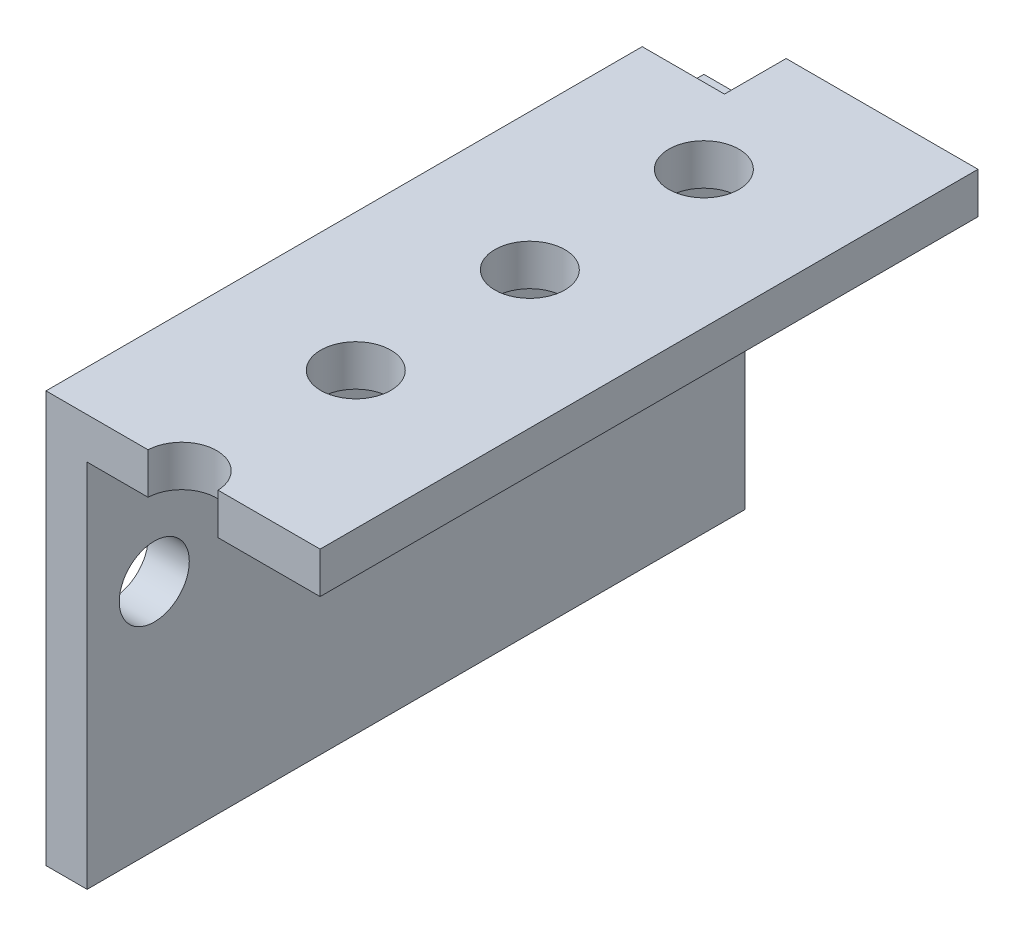
ISO-10303-21;
HEADER;
FILE_DESCRIPTION(('STEP AP214'),'2;1');
FILE_NAME('part.step','',(''),(''),'','','');
FILE_SCHEMA(('AUTOMOTIVE_DESIGN { 1 0 10303 214 1 1 1 1 }'));
ENDSEC;
DATA;
#1=APPLICATION_CONTEXT('core data for automotive mechanical design processes');
#2=APPLICATION_PROTOCOL_DEFINITION('international standard','automotive_design',2000,#1);
#3=PRODUCT_CONTEXT('',#1,'mechanical');
#4=PRODUCT('Part','Part','',(#3));
#5=PRODUCT_RELATED_PRODUCT_CATEGORY('part','',(#4));
#6=PRODUCT_DEFINITION_FORMATION('','',#4);
#7=PRODUCT_DEFINITION_CONTEXT('part definition',#1,'design');
#8=PRODUCT_DEFINITION('design','',#6,#7);
#9=PRODUCT_DEFINITION_SHAPE('','',#8);
#10=(LENGTH_UNIT() NAMED_UNIT(*) SI_UNIT(.MILLI.,.METRE.));
#11=(NAMED_UNIT(*) PLANE_ANGLE_UNIT() SI_UNIT($,.RADIAN.));
#12=(NAMED_UNIT(*) SI_UNIT($,.STERADIAN.) SOLID_ANGLE_UNIT());
#13=UNCERTAINTY_MEASURE_WITH_UNIT(LENGTH_MEASURE(1.E-05),#10,'distance_accuracy_value','');
#14=(GEOMETRIC_REPRESENTATION_CONTEXT(3) GLOBAL_UNCERTAINTY_ASSIGNED_CONTEXT((#13)) GLOBAL_UNIT_ASSIGNED_CONTEXT((#10,
#11,#12)) REPRESENTATION_CONTEXT('',''));
#15=CARTESIAN_POINT('',(0.,0.,0.));
#16=DIRECTION('',(0.,0.,1.));
#17=DIRECTION('',(1.,0.,0.));
#18=AXIS2_PLACEMENT_3D('',#15,#16,#17);
#19=CARTESIAN_POINT('',(0.,100.,0.));
#20=DIRECTION('',(0.,0.,1.));
#21=DIRECTION('',(1.,0.,0.));
#22=AXIS2_PLACEMENT_3D('',#19,#20,#21);
#23=PLANE('',#22);
#24=DIRECTION('',(1.,0.,0.));
#25=VECTOR('',#24,1.);
#26=CARTESIAN_POINT('',(0.,115.,0.));
#27=LINE('',#26,#25);
#28=CARTESIAN_POINT('',(4.5,115.,0.));
#29=VERTEX_POINT('',#28);
#30=CARTESIAN_POINT('',(18.5,115.,0.));
#31=VERTEX_POINT('',#30);
#32=EDGE_CURVE('E257',#29,#31,#27,.T.);
#33=ORIENTED_EDGE('',*,*,#32,.T.);
#34=DIRECTION('',(0.,-1.,0.));
#35=VECTOR('',#34,1.);
#36=CARTESIAN_POINT('',(18.5,100.,0.));
#37=LINE('',#36,#35);
#38=CARTESIAN_POINT('',(18.5,112.,0.));
#39=VERTEX_POINT('',#38);
#40=EDGE_CURVE('E261',#31,#39,#37,.T.);
#41=ORIENTED_EDGE('',*,*,#40,.T.);
#42=DIRECTION('',(1.,0.,0.));
#43=VECTOR('',#42,1.);
#44=CARTESIAN_POINT('',(0.,112.,0.));
#45=LINE('',#44,#43);
#46=CARTESIAN_POINT('',(4.5,112.,0.));
#47=VERTEX_POINT('',#46);
#48=EDGE_CURVE('E265',#47,#39,#45,.T.);
#49=ORIENTED_EDGE('',*,*,#48,.F.);
#50=DIRECTION('',(0.,-1.,0.));
#51=VECTOR('',#50,1.);
#52=CARTESIAN_POINT('',(4.5,100.,0.));
#53=LINE('',#52,#51);
#54=EDGE_CURVE('E56',#29,#47,#53,.T.);
#55=ORIENTED_EDGE('',*,*,#54,.F.);
#56=EDGE_LOOP('',(#33,#41,#49,#55));
#57=FACE_BOUND('',#56,.T.);
#58=ADVANCED_FACE('F47',(#57),#23,.F.);
#59=CARTESIAN_POINT('',(0.,100.,48.));
#60=DIRECTION('',(0.,0.,1.));
#61=DIRECTION('',(1.,0.,0.));
#62=AXIS2_PLACEMENT_3D('',#59,#60,#61);
#63=PLANE('',#62);
#64=DIRECTION('',(0.,-1.,0.));
#65=VECTOR('',#64,1.);
#66=CARTESIAN_POINT('',(11.0530423028227,115.,48.));
#67=LINE('',#66,#65);
#68=CARTESIAN_POINT('',(11.0530423028227,115.,48.));
#69=VERTEX_POINT('',#68);
#70=CARTESIAN_POINT('',(11.0530423028227,112.,48.));
#71=VERTEX_POINT('',#70);
#72=EDGE_CURVE('E295',#69,#71,#67,.T.);
#73=ORIENTED_EDGE('',*,*,#72,.T.);
#74=DIRECTION('',(1.,0.,0.));
#75=VECTOR('',#74,1.);
#76=CARTESIAN_POINT('',(0.,112.,48.));
#77=LINE('',#76,#75);
#78=CARTESIAN_POINT('',(18.5,112.,48.));
#79=VERTEX_POINT('',#78);
#80=EDGE_CURVE('E244',#71,#79,#77,.T.);
#81=ORIENTED_EDGE('',*,*,#80,.T.);
#82=DIRECTION('',(0.,-1.,0.));
#83=VECTOR('',#82,1.);
#84=CARTESIAN_POINT('',(18.5,100.,48.));
#85=LINE('',#84,#83);
#86=CARTESIAN_POINT('',(18.5,115.,48.));
#87=VERTEX_POINT('',#86);
#88=EDGE_CURVE('E240',#87,#79,#85,.T.);
#89=ORIENTED_EDGE('',*,*,#88,.F.);
#90=DIRECTION('',(1.,0.,0.));
#91=VECTOR('',#90,1.);
#92=CARTESIAN_POINT('',(0.,115.,48.));
#93=LINE('',#92,#91);
#94=EDGE_CURVE('E234',#69,#87,#93,.T.);
#95=ORIENTED_EDGE('',*,*,#94,.F.);
#96=EDGE_LOOP('',(#73,#81,#89,#95));
#97=FACE_BOUND('',#96,.T.);
#98=ADVANCED_FACE('F339',(#97),#63,.T.);
#99=CARTESIAN_POINT('',(-1.5,100.,48.));
#100=DIRECTION('',(1.,0.,0.));
#101=DIRECTION('',(0.,-1.,0.));
#102=AXIS2_PLACEMENT_3D('',#99,#100,#101);
#103=PLANE('',#102);
#104=CARTESIAN_POINT('',(-1.5,102.,5.));
#105=DIRECTION('',(1.,0.,0.));
#106=DIRECTION('',(0.,1.,0.));
#107=AXIS2_PLACEMENT_3D('',#104,#105,#106);
#108=CIRCLE('',#107,2.555);
#109=CARTESIAN_POINT('',(-1.5,104.555,5.));
#110=VERTEX_POINT('',#109);
#111=EDGE_CURVE('E182',#110,#110,#108,.T.);
#112=ORIENTED_EDGE('',*,*,#111,.T.);
#113=EDGE_LOOP('',(#112));
#114=FACE_BOUND('',#113,.T.);
#115=CARTESIAN_POINT('',(-1.5,102.,17.7));
#116=DIRECTION('',(1.,0.,0.));
#117=DIRECTION('',(0.,1.,0.));
#118=AXIS2_PLACEMENT_3D('',#115,#116,#117);
#119=CIRCLE('',#118,2.555);
#120=CARTESIAN_POINT('',(-1.5,104.555,17.7));
#121=VERTEX_POINT('',#120);
#122=EDGE_CURVE('E187',#121,#121,#119,.T.);
#123=ORIENTED_EDGE('',*,*,#122,.T.);
#124=EDGE_LOOP('',(#123));
#125=FACE_BOUND('',#124,.T.);
#126=CARTESIAN_POINT('',(-1.5,102.,30.4));
#127=DIRECTION('',(1.,0.,0.));
#128=DIRECTION('',(0.,1.,0.));
#129=AXIS2_PLACEMENT_3D('',#126,#127,#128);
#130=CIRCLE('',#129,2.55500000000001);
#131=CARTESIAN_POINT('',(-1.5,104.555,30.4));
#132=VERTEX_POINT('',#131);
#133=EDGE_CURVE('E191',#132,#132,#130,.T.);
#134=ORIENTED_EDGE('',*,*,#133,.T.);
#135=EDGE_LOOP('',(#134));
#136=FACE_BOUND('',#135,.T.);
#137=CARTESIAN_POINT('',(-1.5,102.,43.1));
#138=DIRECTION('',(1.,0.,0.));
#139=DIRECTION('',(0.,1.,0.));
#140=AXIS2_PLACEMENT_3D('',#137,#138,#139);
#141=CIRCLE('',#140,2.555);
#142=CARTESIAN_POINT('',(-1.5,104.555,43.1));
#143=VERTEX_POINT('',#142);
#144=EDGE_CURVE('E181',#143,#143,#141,.T.);
#145=ORIENTED_EDGE('',*,*,#144,.T.);
#146=EDGE_LOOP('',(#145));
#147=FACE_BOUND('',#146,.T.);
#148=DIRECTION('',(0.,1.,0.));
#149=VECTOR('',#148,1.);
#150=CARTESIAN_POINT('',(-1.5,100.,0.));
#151=LINE('',#150,#149);
#152=CARTESIAN_POINT('',(-1.5,85.,0.));
#153=VERTEX_POINT('',#152);
#154=CARTESIAN_POINT('',(-1.5,111.,0.));
#155=VERTEX_POINT('',#154);
#156=EDGE_CURVE('E202',#153,#155,#151,.T.);
#157=ORIENTED_EDGE('',*,*,#156,.F.);
#158=DIRECTION('',(0.,0.,-1.));
#159=VECTOR('',#158,1.);
#160=CARTESIAN_POINT('',(-1.5,85.,48.));
#161=LINE('',#160,#159);
#162=CARTESIAN_POINT('',(-1.5,85.,48.));
#163=VERTEX_POINT('',#162);
#164=EDGE_CURVE('E254',#163,#153,#161,.T.);
#165=ORIENTED_EDGE('',*,*,#164,.F.);
#166=DIRECTION('',(0.,1.,0.));
#167=VECTOR('',#166,1.);
#168=CARTESIAN_POINT('',(-1.5,100.,48.));
#169=LINE('',#168,#167);
#170=CARTESIAN_POINT('',(-1.5,115.,48.));
#171=VERTEX_POINT('',#170);
#172=EDGE_CURVE('E231',#163,#171,#169,.T.);
#173=ORIENTED_EDGE('',*,*,#172,.T.);
#174=DIRECTION('',(0.,0.,-1.));
#175=VECTOR('',#174,1.);
#176=CARTESIAN_POINT('',(-1.5,115.,48.));
#177=LINE('',#176,#175);
#178=CARTESIAN_POINT('',(-1.5,115.,4.5));
#179=VERTEX_POINT('',#178);
#180=EDGE_CURVE('E159',#171,#179,#177,.T.);
#181=ORIENTED_EDGE('',*,*,#180,.T.);
#182=DIRECTION('',(0.,-1.,0.));
#183=VECTOR('',#182,1.);
#184=CARTESIAN_POINT('',(-1.5,115.,4.5));
#185=LINE('',#184,#183);
#186=CARTESIAN_POINT('',(-1.5,111.,4.5));
#187=VERTEX_POINT('',#186);
#188=EDGE_CURVE('E141',#179,#187,#185,.T.);
#189=ORIENTED_EDGE('',*,*,#188,.T.);
#190=DIRECTION('',(0.,0.,-1.));
#191=VECTOR('',#190,1.);
#192=CARTESIAN_POINT('',(-1.5,111.,4.5));
#193=LINE('',#192,#191);
#194=EDGE_CURVE('E148',#187,#155,#193,.T.);
#195=ORIENTED_EDGE('',*,*,#194,.T.);
#196=EDGE_LOOP('',(#157,#165,#173,#181,#189,#195));
#197=FACE_BOUND('',#196,.T.);
#198=ADVANCED_FACE('F49',(#114,#125,#136,#147,#197),#103,.F.);
#199=CARTESIAN_POINT('',(0.,115.,48.));
#200=DIRECTION('',(0.,-1.,0.));
#201=DIRECTION('',(0.,0.,1.));
#202=AXIS2_PLACEMENT_3D('',#199,#200,#201);
#203=PLANE('',#202);
#204=CARTESIAN_POINT('',(8.5,115.,10.));
#205=DIRECTION('',(0.,1.,0.));
#206=DIRECTION('',(0.,0.,1.));
#207=AXIS2_PLACEMENT_3D('',#204,#205,#206);
#208=CIRCLE('',#207,2.555);
#209=CARTESIAN_POINT('',(8.5,115.,12.555));
#210=VERTEX_POINT('',#209);
#211=EDGE_CURVE('E198',#210,#210,#208,.T.);
#212=ORIENTED_EDGE('',*,*,#211,.F.);
#213=EDGE_LOOP('',(#212));
#214=FACE_BOUND('',#213,.T.);
#215=CARTESIAN_POINT('',(8.50000000000027,115.,35.4));
#216=DIRECTION('',(0.,1.,0.));
#217=DIRECTION('',(0.,0.,1.));
#218=AXIS2_PLACEMENT_3D('',#215,#216,#217);
#219=CIRCLE('',#218,2.555);
#220=CARTESIAN_POINT('',(8.50000000000027,115.,37.955));
#221=VERTEX_POINT('',#220);
#222=EDGE_CURVE('E213',#221,#221,#219,.T.);
#223=ORIENTED_EDGE('',*,*,#222,.F.);
#224=EDGE_LOOP('',(#223));
#225=FACE_BOUND('',#224,.T.);
#226=CARTESIAN_POINT('',(8.50000000000014,115.,22.7));
#227=DIRECTION('',(0.,1.,0.));
#228=DIRECTION('',(0.,0.,1.));
#229=AXIS2_PLACEMENT_3D('',#226,#227,#228);
#230=CIRCLE('',#229,2.555);
#231=CARTESIAN_POINT('',(8.50000000000014,115.,25.255));
#232=VERTEX_POINT('',#231);
#233=EDGE_CURVE('E212',#232,#232,#230,.T.);
#234=ORIENTED_EDGE('',*,*,#233,.F.);
#235=EDGE_LOOP('',(#234));
#236=FACE_BOUND('',#235,.T.);
#237=DIRECTION('',(-1.,0.,0.));
#238=VECTOR('',#237,1.);
#239=CARTESIAN_POINT('',(-1.5,115.,4.5));
#240=LINE('',#239,#238);
#241=CARTESIAN_POINT('',(4.5,115.,4.5));
#242=VERTEX_POINT('',#241);
#243=EDGE_CURVE('E155',#242,#179,#240,.T.);
#244=ORIENTED_EDGE('',*,*,#243,.T.);
#245=ORIENTED_EDGE('',*,*,#180,.F.);
#246=CARTESIAN_POINT('',(5.94695769717814,115.,48.));
#247=VERTEX_POINT('',#246);
#248=EDGE_CURVE('E236',#171,#247,#93,.T.);
#249=ORIENTED_EDGE('',*,*,#248,.T.);
#250=CARTESIAN_POINT('',(8.5000000000004,115.,48.1));
#251=DIRECTION('',(0.,1.,0.));
#252=DIRECTION('',(0.,0.,1.));
#253=AXIS2_PLACEMENT_3D('',#250,#251,#252);
#254=CIRCLE('',#253,2.555);
#255=EDGE_CURVE('E221',#69,#247,#254,.T.);
#256=ORIENTED_EDGE('',*,*,#255,.F.);
#257=ORIENTED_EDGE('',*,*,#94,.T.);
#258=DIRECTION('',(0.,0.,-1.));
#259=VECTOR('',#258,1.);
#260=CARTESIAN_POINT('',(18.5,115.,48.));
#261=LINE('',#260,#259);
#262=EDGE_CURVE('E288',#87,#31,#261,.T.);
#263=ORIENTED_EDGE('',*,*,#262,.T.);
#264=ORIENTED_EDGE('',*,*,#32,.F.);
#265=DIRECTION('',(0.,0.,-1.));
#266=VECTOR('',#265,1.);
#267=CARTESIAN_POINT('',(4.5,115.,4.5));
#268=LINE('',#267,#266);
#269=EDGE_CURVE('E154',#242,#29,#268,.T.);
#270=ORIENTED_EDGE('',*,*,#269,.F.);
#271=EDGE_LOOP('',(#244,#245,#249,#256,#257,#263,#264,#270));
#272=FACE_BOUND('',#271,.T.);
#273=ADVANCED_FACE('F331',(#214,#225,#236,#272),#203,.F.);
#274=CARTESIAN_POINT('',(18.5,100.,48.));
#275=DIRECTION('',(-1.,0.,0.));
#276=DIRECTION('',(0.,0.,1.));
#277=AXIS2_PLACEMENT_3D('',#274,#275,#276);
#278=PLANE('',#277);
#279=ORIENTED_EDGE('',*,*,#40,.F.);
#280=ORIENTED_EDGE('',*,*,#262,.F.);
#281=ORIENTED_EDGE('',*,*,#88,.T.);
#282=DIRECTION('',(0.,0.,-1.));
#283=VECTOR('',#282,1.);
#284=CARTESIAN_POINT('',(18.5,112.,48.));
#285=LINE('',#284,#283);
#286=EDGE_CURVE('E285',#79,#39,#285,.T.);
#287=ORIENTED_EDGE('',*,*,#286,.T.);
#288=EDGE_LOOP('',(#279,#280,#281,#287));
#289=FACE_BOUND('',#288,.T.);
#290=ADVANCED_FACE('F336',(#289),#278,.F.);
#291=CARTESIAN_POINT('',(0.,112.,48.));
#292=DIRECTION('',(0.,-1.,0.));
#293=DIRECTION('',(0.,0.,1.));
#294=AXIS2_PLACEMENT_3D('',#291,#292,#293);
#295=PLANE('',#294);
#296=DIRECTION('',(0.,0.,-1.));
#297=VECTOR('',#296,1.);
#298=CARTESIAN_POINT('',(4.5,112.,48.));
#299=LINE('',#298,#297);
#300=CARTESIAN_POINT('',(4.5,112.,4.5));
#301=VERTEX_POINT('',#300);
#302=EDGE_CURVE('E175',#301,#47,#299,.T.);
#303=ORIENTED_EDGE('',*,*,#302,.T.);
#304=ORIENTED_EDGE('',*,*,#48,.T.);
#305=ORIENTED_EDGE('',*,*,#286,.F.);
#306=ORIENTED_EDGE('',*,*,#80,.F.);
#307=CARTESIAN_POINT('',(8.5000000000004,112.,48.1));
#308=DIRECTION('',(0.,1.,0.));
#309=DIRECTION('',(0.,0.,1.));
#310=AXIS2_PLACEMENT_3D('',#307,#308,#309);
#311=CIRCLE('',#310,2.555);
#312=CARTESIAN_POINT('',(5.94695769717814,112.,48.));
#313=VERTEX_POINT('',#312);
#314=EDGE_CURVE('E207',#71,#313,#311,.T.);
#315=ORIENTED_EDGE('',*,*,#314,.T.);
#316=CARTESIAN_POINT('',(1.5,112.,48.));
#317=VERTEX_POINT('',#316);
#318=EDGE_CURVE('E245',#317,#313,#77,.T.);
#319=ORIENTED_EDGE('',*,*,#318,.F.);
#320=DIRECTION('',(0.,0.,-1.));
#321=VECTOR('',#320,1.);
#322=CARTESIAN_POINT('',(1.5,112.,48.));
#323=LINE('',#322,#321);
#324=CARTESIAN_POINT('',(1.5,112.,4.5));
#325=VERTEX_POINT('',#324);
#326=EDGE_CURVE('E281',#317,#325,#323,.T.);
#327=ORIENTED_EDGE('',*,*,#326,.T.);
#328=DIRECTION('',(-1.,0.,0.));
#329=VECTOR('',#328,1.);
#330=CARTESIAN_POINT('',(0.,112.,4.5));
#331=LINE('',#330,#329);
#332=EDGE_CURVE('E178',#301,#325,#331,.T.);
#333=ORIENTED_EDGE('',*,*,#332,.F.);
#334=EDGE_LOOP('',(#303,#304,#305,#306,#315,#319,#327,#333));
#335=FACE_BOUND('',#334,.T.);
#336=CARTESIAN_POINT('',(8.5,112.,10.));
#337=DIRECTION('',(0.,1.,0.));
#338=DIRECTION('',(0.,0.,1.));
#339=AXIS2_PLACEMENT_3D('',#336,#337,#338);
#340=CIRCLE('',#339,2.555);
#341=CARTESIAN_POINT('',(8.5,112.,12.555));
#342=VERTEX_POINT('',#341);
#343=EDGE_CURVE('E203',#342,#342,#340,.T.);
#344=ORIENTED_EDGE('',*,*,#343,.T.);
#345=EDGE_LOOP('',(#344));
#346=FACE_BOUND('',#345,.T.);
#347=CARTESIAN_POINT('',(8.50000000000027,112.,35.4));
#348=DIRECTION('',(0.,1.,0.));
#349=DIRECTION('',(0.,0.,1.));
#350=AXIS2_PLACEMENT_3D('',#347,#348,#349);
#351=CIRCLE('',#350,2.555);
#352=CARTESIAN_POINT('',(8.50000000000027,112.,37.955));
#353=VERTEX_POINT('',#352);
#354=EDGE_CURVE('E208',#353,#353,#351,.T.);
#355=ORIENTED_EDGE('',*,*,#354,.T.);
#356=EDGE_LOOP('',(#355));
#357=FACE_BOUND('',#356,.T.);
#358=CARTESIAN_POINT('',(8.50000000000014,112.,22.7));
#359=DIRECTION('',(0.,1.,0.));
#360=DIRECTION('',(0.,0.,1.));
#361=AXIS2_PLACEMENT_3D('',#358,#359,#360);
#362=CIRCLE('',#361,2.555);
#363=CARTESIAN_POINT('',(8.50000000000014,112.,25.255));
#364=VERTEX_POINT('',#363);
#365=EDGE_CURVE('E224',#364,#364,#362,.T.);
#366=ORIENTED_EDGE('',*,*,#365,.T.);
#367=EDGE_LOOP('',(#366));
#368=FACE_BOUND('',#367,.T.);
#369=ADVANCED_FACE('F324',(#335,#346,#357,#368),#295,.T.);
#370=CARTESIAN_POINT('',(1.5,100.,48.));
#371=DIRECTION('',(1.,0.,0.));
#372=DIRECTION('',(0.,-1.,0.));
#373=AXIS2_PLACEMENT_3D('',#370,#371,#372);
#374=PLANE('',#373);
#375=DIRECTION('',(0.,0.,1.));
#376=VECTOR('',#375,1.);
#377=CARTESIAN_POINT('',(1.5,111.,48.));
#378=LINE('',#377,#376);
#379=CARTESIAN_POINT('',(1.5,111.,0.));
#380=VERTEX_POINT('',#379);
#381=CARTESIAN_POINT('',(1.5,111.,4.5));
#382=VERTEX_POINT('',#381);
#383=EDGE_CURVE('E171',#380,#382,#378,.T.);
#384=ORIENTED_EDGE('',*,*,#383,.T.);
#385=DIRECTION('',(0.,-1.,0.));
#386=VECTOR('',#385,1.);
#387=CARTESIAN_POINT('',(1.5,100.,4.5));
#388=LINE('',#387,#386);
#389=EDGE_CURVE('E11',#325,#382,#388,.T.);
#390=ORIENTED_EDGE('',*,*,#389,.F.);
#391=ORIENTED_EDGE('',*,*,#326,.F.);
#392=DIRECTION('',(0.,1.,0.));
#393=VECTOR('',#392,1.);
#394=CARTESIAN_POINT('',(1.5,100.,48.));
#395=LINE('',#394,#393);
#396=CARTESIAN_POINT('',(1.5,85.,48.));
#397=VERTEX_POINT('',#396);
#398=EDGE_CURVE('E248',#397,#317,#395,.T.);
#399=ORIENTED_EDGE('',*,*,#398,.F.);
#400=DIRECTION('',(0.,0.,-1.));
#401=VECTOR('',#400,1.);
#402=CARTESIAN_POINT('',(1.5,85.,48.));
#403=LINE('',#402,#401);
#404=CARTESIAN_POINT('',(1.5,85.,0.));
#405=VERTEX_POINT('',#404);
#406=EDGE_CURVE('E278',#397,#405,#403,.T.);
#407=ORIENTED_EDGE('',*,*,#406,.T.);
#408=DIRECTION('',(0.,1.,0.));
#409=VECTOR('',#408,1.);
#410=CARTESIAN_POINT('',(1.5,100.,0.));
#411=LINE('',#410,#409);
#412=EDGE_CURVE('E269',#405,#380,#411,.T.);
#413=ORIENTED_EDGE('',*,*,#412,.T.);
#414=EDGE_LOOP('',(#384,#390,#391,#399,#407,#413));
#415=FACE_BOUND('',#414,.T.);
#416=CARTESIAN_POINT('',(1.5,102.,5.));
#417=DIRECTION('',(-1.,0.,0.));
#418=DIRECTION('',(0.,-1.,0.));
#419=AXIS2_PLACEMENT_3D('',#416,#417,#418);
#420=CIRCLE('',#419,2.555);
#421=CARTESIAN_POINT('',(1.5,99.445,5.));
#422=VERTEX_POINT('',#421);
#423=EDGE_CURVE('E217',#422,#422,#420,.T.);
#424=ORIENTED_EDGE('',*,*,#423,.T.);
#425=EDGE_LOOP('',(#424));
#426=FACE_BOUND('',#425,.T.);
#427=CARTESIAN_POINT('',(1.5,102.,17.7));
#428=DIRECTION('',(-1.,0.,0.));
#429=DIRECTION('',(0.,-1.,0.));
#430=AXIS2_PLACEMENT_3D('',#427,#428,#429);
#431=CIRCLE('',#430,2.555);
#432=CARTESIAN_POINT('',(1.5,99.445,17.7));
#433=VERTEX_POINT('',#432);
#434=EDGE_CURVE('E306',#433,#433,#431,.T.);
#435=ORIENTED_EDGE('',*,*,#434,.T.);
#436=EDGE_LOOP('',(#435));
#437=FACE_BOUND('',#436,.T.);
#438=CARTESIAN_POINT('',(1.5,102.,30.4));
#439=DIRECTION('',(-1.,0.,0.));
#440=DIRECTION('',(0.,-1.,0.));
#441=AXIS2_PLACEMENT_3D('',#438,#439,#440);
#442=CIRCLE('',#441,2.55500000000001);
#443=CARTESIAN_POINT('',(1.5,99.445,30.4));
#444=VERTEX_POINT('',#443);
#445=EDGE_CURVE('E302',#444,#444,#442,.T.);
#446=ORIENTED_EDGE('',*,*,#445,.T.);
#447=EDGE_LOOP('',(#446));
#448=FACE_BOUND('',#447,.T.);
#449=CARTESIAN_POINT('',(1.5,102.,43.1));
#450=DIRECTION('',(-1.,0.,0.));
#451=DIRECTION('',(0.,-1.,0.));
#452=AXIS2_PLACEMENT_3D('',#449,#450,#451);
#453=CIRCLE('',#452,2.555);
#454=CARTESIAN_POINT('',(1.5,99.445,43.1));
#455=VERTEX_POINT('',#454);
#456=EDGE_CURVE('E186',#455,#455,#453,.T.);
#457=ORIENTED_EDGE('',*,*,#456,.T.);
#458=EDGE_LOOP('',(#457));
#459=FACE_BOUND('',#458,.T.);
#460=ADVANCED_FACE('F351',(#415,#426,#437,#448,#459),#374,.T.);
#461=CARTESIAN_POINT('',(0.,85.,48.));
#462=DIRECTION('',(0.,-1.,0.));
#463=DIRECTION('',(0.,0.,1.));
#464=AXIS2_PLACEMENT_3D('',#461,#462,#463);
#465=PLANE('',#464);
#466=DIRECTION('',(1.,0.,0.));
#467=VECTOR('',#466,1.);
#468=CARTESIAN_POINT('',(0.,85.,0.));
#469=LINE('',#468,#467);
#470=EDGE_CURVE('E235',#153,#405,#469,.T.);
#471=ORIENTED_EDGE('',*,*,#470,.T.);
#472=ORIENTED_EDGE('',*,*,#406,.F.);
#473=DIRECTION('',(1.,0.,0.));
#474=VECTOR('',#473,1.);
#475=CARTESIAN_POINT('',(0.,85.,48.));
#476=LINE('',#475,#474);
#477=EDGE_CURVE('E251',#163,#397,#476,.T.);
#478=ORIENTED_EDGE('',*,*,#477,.F.);
#479=ORIENTED_EDGE('',*,*,#164,.T.);
#480=EDGE_LOOP('',(#471,#472,#478,#479));
#481=FACE_BOUND('',#480,.T.);
#482=ADVANCED_FACE('F357',(#481),#465,.T.);
#483=DIRECTION('',(0.,-1.,0.));
#484=VECTOR('',#483,1.);
#485=CARTESIAN_POINT('',(5.94695769717814,115.,48.));
#486=LINE('',#485,#484);
#487=EDGE_CURVE('E71',#313,#247,#486,.F.);
#488=ORIENTED_EDGE('',*,*,#487,.T.);
#489=ORIENTED_EDGE('',*,*,#248,.F.);
#490=ORIENTED_EDGE('',*,*,#172,.F.);
#491=ORIENTED_EDGE('',*,*,#477,.T.);
#492=ORIENTED_EDGE('',*,*,#398,.T.);
#493=ORIENTED_EDGE('',*,*,#318,.T.);
#494=EDGE_LOOP('',(#488,#489,#490,#491,#492,#493));
#495=FACE_BOUND('',#494,.T.);
#496=ADVANCED_FACE('F346',(#495),#63,.T.);
#497=ORIENTED_EDGE('',*,*,#412,.F.);
#498=ORIENTED_EDGE('',*,*,#470,.F.);
#499=ORIENTED_EDGE('',*,*,#156,.T.);
#500=DIRECTION('',(1.,0.,0.));
#501=VECTOR('',#500,1.);
#502=CARTESIAN_POINT('',(-1.5,111.,0.));
#503=LINE('',#502,#501);
#504=EDGE_CURVE('E63',#155,#380,#503,.T.);
#505=ORIENTED_EDGE('',*,*,#504,.T.);
#506=EDGE_LOOP('',(#497,#498,#499,#505));
#507=FACE_BOUND('',#506,.T.);
#508=ADVANCED_FACE('F355',(#507),#23,.F.);
#509=CARTESIAN_POINT('',(8.5000000000004,115.,48.1));
#510=DIRECTION('',(0.,-1.,0.));
#511=DIRECTION('',(0.,0.,1.));
#512=AXIS2_PLACEMENT_3D('',#509,#510,#511);
#513=CYLINDRICAL_SURFACE('',#512,2.555);
#514=ORIENTED_EDGE('',*,*,#72,.F.);
#515=ORIENTED_EDGE('',*,*,#255,.T.);
#516=ORIENTED_EDGE('',*,*,#487,.F.);
#517=ORIENTED_EDGE('',*,*,#314,.F.);
#518=EDGE_LOOP('',(#514,#515,#516,#517));
#519=FACE_BOUND('',#518,.T.);
#520=ADVANCED_FACE('F343',(#519),#513,.F.);
#521=CARTESIAN_POINT('',(8.50000000000014,115.,22.7));
#522=DIRECTION('',(0.,-1.,0.));
#523=DIRECTION('',(0.,0.,1.));
#524=AXIS2_PLACEMENT_3D('',#521,#522,#523);
#525=CYLINDRICAL_SURFACE('',#524,2.555);
#526=ORIENTED_EDGE('',*,*,#233,.T.);
#527=EDGE_LOOP('',(#526));
#528=FACE_BOUND('',#527,.T.);
#529=ORIENTED_EDGE('',*,*,#365,.F.);
#530=EDGE_LOOP('',(#529));
#531=FACE_BOUND('',#530,.T.);
#532=ADVANCED_FACE('F372',(#528,#531),#525,.F.);
#533=CARTESIAN_POINT('',(8.50000000000027,115.,35.4));
#534=DIRECTION('',(0.,-1.,0.));
#535=DIRECTION('',(0.,0.,1.));
#536=AXIS2_PLACEMENT_3D('',#533,#534,#535);
#537=CYLINDRICAL_SURFACE('',#536,2.555);
#538=ORIENTED_EDGE('',*,*,#222,.T.);
#539=EDGE_LOOP('',(#538));
#540=FACE_BOUND('',#539,.T.);
#541=ORIENTED_EDGE('',*,*,#354,.F.);
#542=EDGE_LOOP('',(#541));
#543=FACE_BOUND('',#542,.T.);
#544=ADVANCED_FACE('F376',(#540,#543),#537,.F.);
#545=CARTESIAN_POINT('',(8.5,115.,10.));
#546=DIRECTION('',(0.,-1.,0.));
#547=DIRECTION('',(0.,0.,1.));
#548=AXIS2_PLACEMENT_3D('',#545,#546,#547);
#549=CYLINDRICAL_SURFACE('',#548,2.555);
#550=ORIENTED_EDGE('',*,*,#211,.T.);
#551=EDGE_LOOP('',(#550));
#552=FACE_BOUND('',#551,.T.);
#553=ORIENTED_EDGE('',*,*,#343,.F.);
#554=EDGE_LOOP('',(#553));
#555=FACE_BOUND('',#554,.T.);
#556=ADVANCED_FACE('F382',(#552,#555),#549,.F.);
#557=CARTESIAN_POINT('',(18.5,102.,43.1));
#558=DIRECTION('',(-1.,0.,0.));
#559=DIRECTION('',(0.,1.,0.));
#560=AXIS2_PLACEMENT_3D('',#557,#558,#559);
#561=CYLINDRICAL_SURFACE('',#560,2.555);
#562=ORIENTED_EDGE('',*,*,#456,.F.);
#563=EDGE_LOOP('',(#562));
#564=FACE_BOUND('',#563,.T.);
#565=ORIENTED_EDGE('',*,*,#144,.F.);
#566=EDGE_LOOP('',(#565));
#567=FACE_BOUND('',#566,.T.);
#568=ADVANCED_FACE('F386',(#564,#567),#561,.F.);
#569=CARTESIAN_POINT('',(18.5,102.,30.4));
#570=DIRECTION('',(-1.,0.,0.));
#571=DIRECTION('',(0.,1.,0.));
#572=AXIS2_PLACEMENT_3D('',#569,#570,#571);
#573=CYLINDRICAL_SURFACE('',#572,2.55500000000001);
#574=ORIENTED_EDGE('',*,*,#445,.F.);
#575=EDGE_LOOP('',(#574));
#576=FACE_BOUND('',#575,.T.);
#577=ORIENTED_EDGE('',*,*,#133,.F.);
#578=EDGE_LOOP('',(#577));
#579=FACE_BOUND('',#578,.T.);
#580=ADVANCED_FACE('F390',(#576,#579),#573,.F.);
#581=CARTESIAN_POINT('',(18.5,102.,17.7));
#582=DIRECTION('',(-1.,0.,0.));
#583=DIRECTION('',(0.,1.,0.));
#584=AXIS2_PLACEMENT_3D('',#581,#582,#583);
#585=CYLINDRICAL_SURFACE('',#584,2.555);
#586=ORIENTED_EDGE('',*,*,#434,.F.);
#587=EDGE_LOOP('',(#586));
#588=FACE_BOUND('',#587,.T.);
#589=ORIENTED_EDGE('',*,*,#122,.F.);
#590=EDGE_LOOP('',(#589));
#591=FACE_BOUND('',#590,.T.);
#592=ADVANCED_FACE('F394',(#588,#591),#585,.F.);
#593=CARTESIAN_POINT('',(18.5,102.,5.));
#594=DIRECTION('',(-1.,0.,0.));
#595=DIRECTION('',(0.,1.,0.));
#596=AXIS2_PLACEMENT_3D('',#593,#594,#595);
#597=CYLINDRICAL_SURFACE('',#596,2.555);
#598=ORIENTED_EDGE('',*,*,#423,.F.);
#599=EDGE_LOOP('',(#598));
#600=FACE_BOUND('',#599,.T.);
#601=ORIENTED_EDGE('',*,*,#111,.F.);
#602=EDGE_LOOP('',(#601));
#603=FACE_BOUND('',#602,.T.);
#604=ADVANCED_FACE('F398',(#600,#603),#597,.F.);
#605=CARTESIAN_POINT('',(4.5,115.,4.5));
#606=DIRECTION('',(1.,0.,0.));
#607=DIRECTION('',(0.,0.,-1.));
#608=AXIS2_PLACEMENT_3D('',#605,#606,#607);
#609=PLANE('',#608);
#610=ORIENTED_EDGE('',*,*,#302,.F.);
#611=DIRECTION('',(0.,1.,0.));
#612=VECTOR('',#611,1.);
#613=CARTESIAN_POINT('',(4.5,115.,4.5));
#614=LINE('',#613,#612);
#615=EDGE_CURVE('E146',#301,#242,#614,.T.);
#616=ORIENTED_EDGE('',*,*,#615,.T.);
#617=ORIENTED_EDGE('',*,*,#269,.T.);
#618=ORIENTED_EDGE('',*,*,#54,.T.);
#619=EDGE_LOOP('',(#610,#616,#617,#618));
#620=FACE_BOUND('',#619,.T.);
#621=ADVANCED_FACE('F318',(#620),#609,.F.);
#622=CARTESIAN_POINT('',(-1.5,111.,4.5));
#623=DIRECTION('',(0.,-1.,0.));
#624=DIRECTION('',(0.,0.,1.));
#625=AXIS2_PLACEMENT_3D('',#622,#623,#624);
#626=PLANE('',#625);
#627=ORIENTED_EDGE('',*,*,#383,.F.);
#628=ORIENTED_EDGE('',*,*,#504,.F.);
#629=ORIENTED_EDGE('',*,*,#194,.F.);
#630=DIRECTION('',(1.,0.,0.));
#631=VECTOR('',#630,1.);
#632=CARTESIAN_POINT('',(-1.5,111.,4.5));
#633=LINE('',#632,#631);
#634=EDGE_CURVE('E137',#187,#382,#633,.T.);
#635=ORIENTED_EDGE('',*,*,#634,.T.);
#636=EDGE_LOOP('',(#627,#628,#629,#635));
#637=FACE_BOUND('',#636,.T.);
#638=ADVANCED_FACE('F149',(#637),#626,.F.);
#639=CARTESIAN_POINT('',(0.,100.,4.5));
#640=DIRECTION('',(0.,0.,-1.));
#641=DIRECTION('',(-1.,0.,0.));
#642=AXIS2_PLACEMENT_3D('',#639,#640,#641);
#643=PLANE('',#642);
#644=ORIENTED_EDGE('',*,*,#615,.F.);
#645=ORIENTED_EDGE('',*,*,#332,.T.);
#646=ORIENTED_EDGE('',*,*,#389,.T.);
#647=ORIENTED_EDGE('',*,*,#634,.F.);
#648=ORIENTED_EDGE('',*,*,#188,.F.);
#649=ORIENTED_EDGE('',*,*,#243,.F.);
#650=EDGE_LOOP('',(#644,#645,#646,#647,#648,#649));
#651=FACE_BOUND('',#650,.T.);
#652=ADVANCED_FACE('F138',(#651),#643,.T.);
#653=CLOSED_SHELL('',(#58,#98,#198,#273,#290,#369,#460,#482,#496,#508,#520,#532,#544,#556,#568,
#580,#592,#604,#621,#638,#652));
#654=MANIFOLD_SOLID_BREP('B2',#653);
#655=ADVANCED_BREP_SHAPE_REPRESENTATION('',(#18,#654),#14);
#656=SHAPE_DEFINITION_REPRESENTATION(#9,#655);
ENDSEC;
END-ISO-10303-21;
